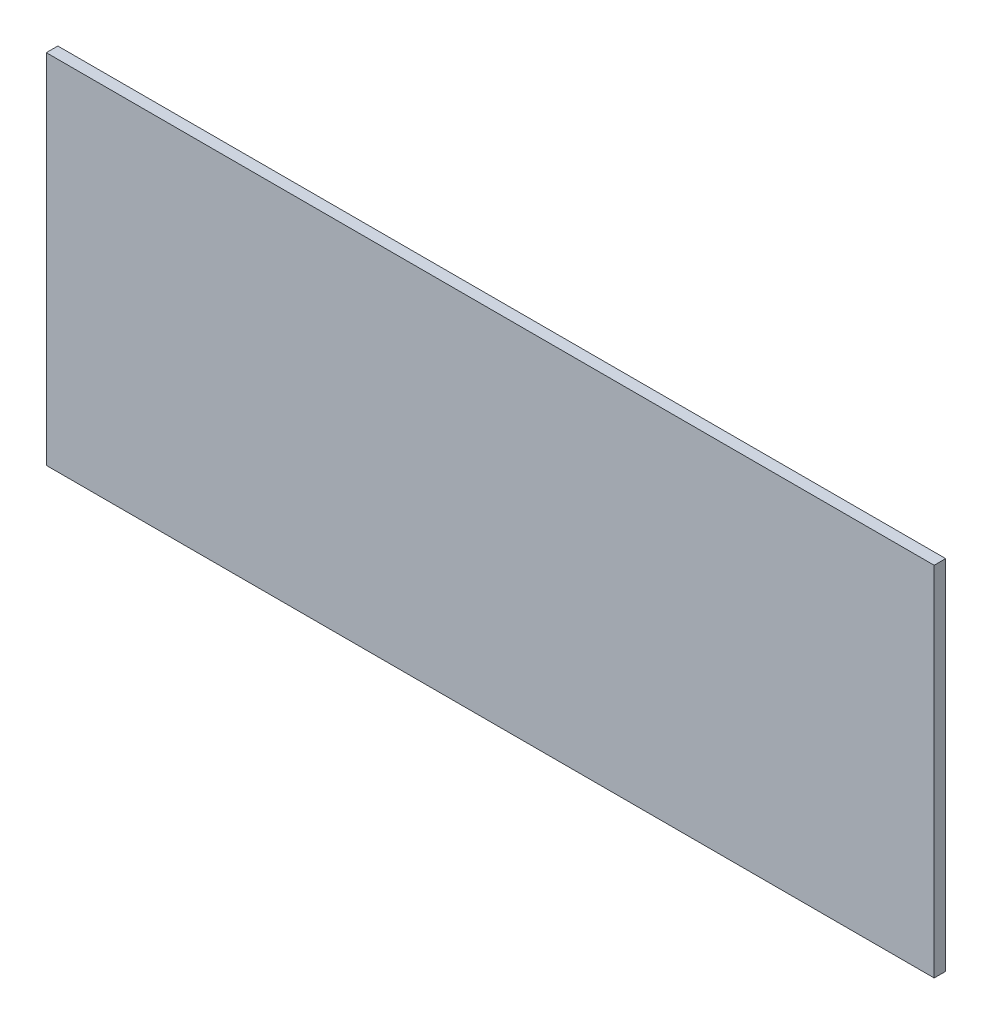
ISO-10303-21;
HEADER;
FILE_DESCRIPTION(('STEP AP214'),'2;1');
FILE_NAME('part.step','',(''),(''),'','','');
FILE_SCHEMA(('AUTOMOTIVE_DESIGN { 1 0 10303 214 1 1 1 1 }'));
ENDSEC;
DATA;
#1=APPLICATION_CONTEXT('core data for automotive mechanical design processes');
#2=APPLICATION_PROTOCOL_DEFINITION('international standard','automotive_design',2000,#1);
#3=PRODUCT_CONTEXT('',#1,'mechanical');
#4=PRODUCT('Part','Part','',(#3));
#5=PRODUCT_RELATED_PRODUCT_CATEGORY('part','',(#4));
#6=PRODUCT_DEFINITION_FORMATION('','',#4);
#7=PRODUCT_DEFINITION_CONTEXT('part definition',#1,'design');
#8=PRODUCT_DEFINITION('design','',#6,#7);
#9=PRODUCT_DEFINITION_SHAPE('','',#8);
#10=(LENGTH_UNIT() NAMED_UNIT(*) SI_UNIT(.MILLI.,.METRE.));
#11=(NAMED_UNIT(*) PLANE_ANGLE_UNIT() SI_UNIT($,.RADIAN.));
#12=(NAMED_UNIT(*) SI_UNIT($,.STERADIAN.) SOLID_ANGLE_UNIT());
#13=UNCERTAINTY_MEASURE_WITH_UNIT(LENGTH_MEASURE(1.E-05),#10,'distance_accuracy_value','');
#14=(GEOMETRIC_REPRESENTATION_CONTEXT(3) GLOBAL_UNCERTAINTY_ASSIGNED_CONTEXT((#13)) GLOBAL_UNIT_ASSIGNED_CONTEXT((#10,
#11,#12)) REPRESENTATION_CONTEXT('',''));
#15=CARTESIAN_POINT('',(0.,0.,0.));
#16=DIRECTION('',(0.,0.,1.));
#17=DIRECTION('',(1.,0.,0.));
#18=AXIS2_PLACEMENT_3D('',#15,#16,#17);
#19=CARTESIAN_POINT('',(0.,0.,2.));
#20=DIRECTION('',(1.,0.,0.));
#21=DIRECTION('',(0.,1.,0.));
#22=AXIS2_PLACEMENT_3D('',#19,#20,#21);
#23=PLANE('',#22);
#24=DIRECTION('',(0.,-1.,0.));
#25=VECTOR('',#24,1.);
#26=CARTESIAN_POINT('',(0.,0.,0.));
#27=LINE('',#26,#25);
#28=CARTESIAN_POINT('',(0.,0.,0.));
#29=VERTEX_POINT('',#28);
#30=CARTESIAN_POINT('',(0.,-62.,0.));
#31=VERTEX_POINT('',#30);
#32=EDGE_CURVE('E107',#29,#31,#27,.T.);
#33=ORIENTED_EDGE('',*,*,#32,.T.);
#34=DIRECTION('',(0.,0.,-1.));
#35=VECTOR('',#34,1.);
#36=CARTESIAN_POINT('',(0.,-62.,2.));
#37=LINE('',#36,#35);
#38=CARTESIAN_POINT('',(0.,-62.,2.));
#39=VERTEX_POINT('',#38);
#40=EDGE_CURVE('E11',#39,#31,#37,.T.);
#41=ORIENTED_EDGE('',*,*,#40,.F.);
#42=DIRECTION('',(0.,-1.,0.));
#43=VECTOR('',#42,1.);
#44=CARTESIAN_POINT('',(0.,0.,2.));
#45=LINE('',#44,#43);
#46=CARTESIAN_POINT('',(0.,0.,2.));
#47=VERTEX_POINT('',#46);
#48=EDGE_CURVE('E91',#47,#39,#45,.T.);
#49=ORIENTED_EDGE('',*,*,#48,.F.);
#50=DIRECTION('',(0.,0.,-1.));
#51=VECTOR('',#50,1.);
#52=CARTESIAN_POINT('',(0.,0.,2.));
#53=LINE('',#52,#51);
#54=EDGE_CURVE('E103',#47,#29,#53,.T.);
#55=ORIENTED_EDGE('',*,*,#54,.T.);
#56=EDGE_LOOP('',(#33,#41,#49,#55));
#57=FACE_BOUND('',#56,.T.);
#58=ADVANCED_FACE('F39',(#57),#23,.F.);
#59=CARTESIAN_POINT('',(0.,-62.,2.));
#60=DIRECTION('',(0.,1.,0.));
#61=DIRECTION('',(0.,0.,1.));
#62=AXIS2_PLACEMENT_3D('',#59,#60,#61);
#63=PLANE('',#62);
#64=DIRECTION('',(1.,0.,0.));
#65=VECTOR('',#64,1.);
#66=CARTESIAN_POINT('',(0.,-62.,0.));
#67=LINE('',#66,#65);
#68=CARTESIAN_POINT('',(154.,-62.,0.));
#69=VERTEX_POINT('',#68);
#70=EDGE_CURVE('E96',#31,#69,#67,.T.);
#71=ORIENTED_EDGE('',*,*,#70,.T.);
#72=DIRECTION('',(0.,0.,-1.));
#73=VECTOR('',#72,1.);
#74=CARTESIAN_POINT('',(154.,-62.,2.));
#75=LINE('',#74,#73);
#76=CARTESIAN_POINT('',(154.,-62.,2.));
#77=VERTEX_POINT('',#76);
#78=EDGE_CURVE('E48',#77,#69,#75,.T.);
#79=ORIENTED_EDGE('',*,*,#78,.F.);
#80=DIRECTION('',(1.,0.,0.));
#81=VECTOR('',#80,1.);
#82=CARTESIAN_POINT('',(0.,-62.,2.));
#83=LINE('',#82,#81);
#84=EDGE_CURVE('E86',#39,#77,#83,.T.);
#85=ORIENTED_EDGE('',*,*,#84,.F.);
#86=ORIENTED_EDGE('',*,*,#40,.T.);
#87=EDGE_LOOP('',(#71,#79,#85,#86));
#88=FACE_BOUND('',#87,.T.);
#89=ADVANCED_FACE('F95',(#88),#63,.F.);
#90=CARTESIAN_POINT('',(154.,0.,2.));
#91=DIRECTION('',(-1.,0.,0.));
#92=DIRECTION('',(0.,-1.,0.));
#93=AXIS2_PLACEMENT_3D('',#90,#91,#92);
#94=PLANE('',#93);
#95=DIRECTION('',(0.,1.,0.));
#96=VECTOR('',#95,1.);
#97=CARTESIAN_POINT('',(154.,0.,0.));
#98=LINE('',#97,#96);
#99=CARTESIAN_POINT('',(154.,0.,0.));
#100=VERTEX_POINT('',#99);
#101=EDGE_CURVE('E73',#69,#100,#98,.T.);
#102=ORIENTED_EDGE('',*,*,#101,.T.);
#103=DIRECTION('',(0.,0.,-1.));
#104=VECTOR('',#103,1.);
#105=CARTESIAN_POINT('',(154.,0.,2.));
#106=LINE('',#105,#104);
#107=CARTESIAN_POINT('',(154.,0.,2.));
#108=VERTEX_POINT('',#107);
#109=EDGE_CURVE('E98',#108,#100,#106,.T.);
#110=ORIENTED_EDGE('',*,*,#109,.F.);
#111=DIRECTION('',(0.,1.,0.));
#112=VECTOR('',#111,1.);
#113=CARTESIAN_POINT('',(154.,0.,2.));
#114=LINE('',#113,#112);
#115=EDGE_CURVE('E89',#77,#108,#114,.T.);
#116=ORIENTED_EDGE('',*,*,#115,.F.);
#117=ORIENTED_EDGE('',*,*,#78,.T.);
#118=EDGE_LOOP('',(#102,#110,#116,#117));
#119=FACE_BOUND('',#118,.T.);
#120=ADVANCED_FACE('F99',(#119),#94,.F.);
#121=CARTESIAN_POINT('',(0.,0.,2.));
#122=DIRECTION('',(0.,-1.,0.));
#123=DIRECTION('',(0.,0.,-1.));
#124=AXIS2_PLACEMENT_3D('',#121,#122,#123);
#125=PLANE('',#124);
#126=DIRECTION('',(-1.,0.,0.));
#127=VECTOR('',#126,1.);
#128=CARTESIAN_POINT('',(0.,0.,0.));
#129=LINE('',#128,#127);
#130=EDGE_CURVE('E79',#100,#29,#129,.T.);
#131=ORIENTED_EDGE('',*,*,#130,.T.);
#132=ORIENTED_EDGE('',*,*,#54,.F.);
#133=DIRECTION('',(-1.,0.,0.));
#134=VECTOR('',#133,1.);
#135=CARTESIAN_POINT('',(0.,0.,2.));
#136=LINE('',#135,#134);
#137=EDGE_CURVE('E56',#108,#47,#136,.T.);
#138=ORIENTED_EDGE('',*,*,#137,.F.);
#139=ORIENTED_EDGE('',*,*,#109,.T.);
#140=EDGE_LOOP('',(#131,#132,#138,#139));
#141=FACE_BOUND('',#140,.T.);
#142=ADVANCED_FACE('F120',(#141),#125,.F.);
#143=CARTESIAN_POINT('',(0.,0.,2.));
#144=DIRECTION('',(0.,0.,1.));
#145=DIRECTION('',(1.,0.,0.));
#146=AXIS2_PLACEMENT_3D('',#143,#144,#145);
#147=PLANE('',#146);
#148=ORIENTED_EDGE('',*,*,#48,.T.);
#149=ORIENTED_EDGE('',*,*,#84,.T.);
#150=ORIENTED_EDGE('',*,*,#115,.T.);
#151=ORIENTED_EDGE('',*,*,#137,.T.);
#152=EDGE_LOOP('',(#148,#149,#150,#151));
#153=FACE_BOUND('',#152,.T.);
#154=ADVANCED_FACE('F87',(#153),#147,.T.);
#155=CARTESIAN_POINT('',(0.,0.,0.));
#156=DIRECTION('',(0.,0.,1.));
#157=DIRECTION('',(1.,0.,0.));
#158=AXIS2_PLACEMENT_3D('',#155,#156,#157);
#159=PLANE('',#158);
#160=ORIENTED_EDGE('',*,*,#32,.F.);
#161=ORIENTED_EDGE('',*,*,#130,.F.);
#162=ORIENTED_EDGE('',*,*,#101,.F.);
#163=ORIENTED_EDGE('',*,*,#70,.F.);
#164=EDGE_LOOP('',(#160,#161,#162,#163));
#165=FACE_BOUND('',#164,.T.);
#166=ADVANCED_FACE('F123',(#165),#159,.F.);
#167=CLOSED_SHELL('',(#58,#89,#120,#142,#154,#166));
#168=MANIFOLD_SOLID_BREP('B2',#167);
#169=ADVANCED_BREP_SHAPE_REPRESENTATION('',(#18,#168),#14);
#170=SHAPE_DEFINITION_REPRESENTATION(#9,#169);
ENDSEC;
END-ISO-10303-21;
